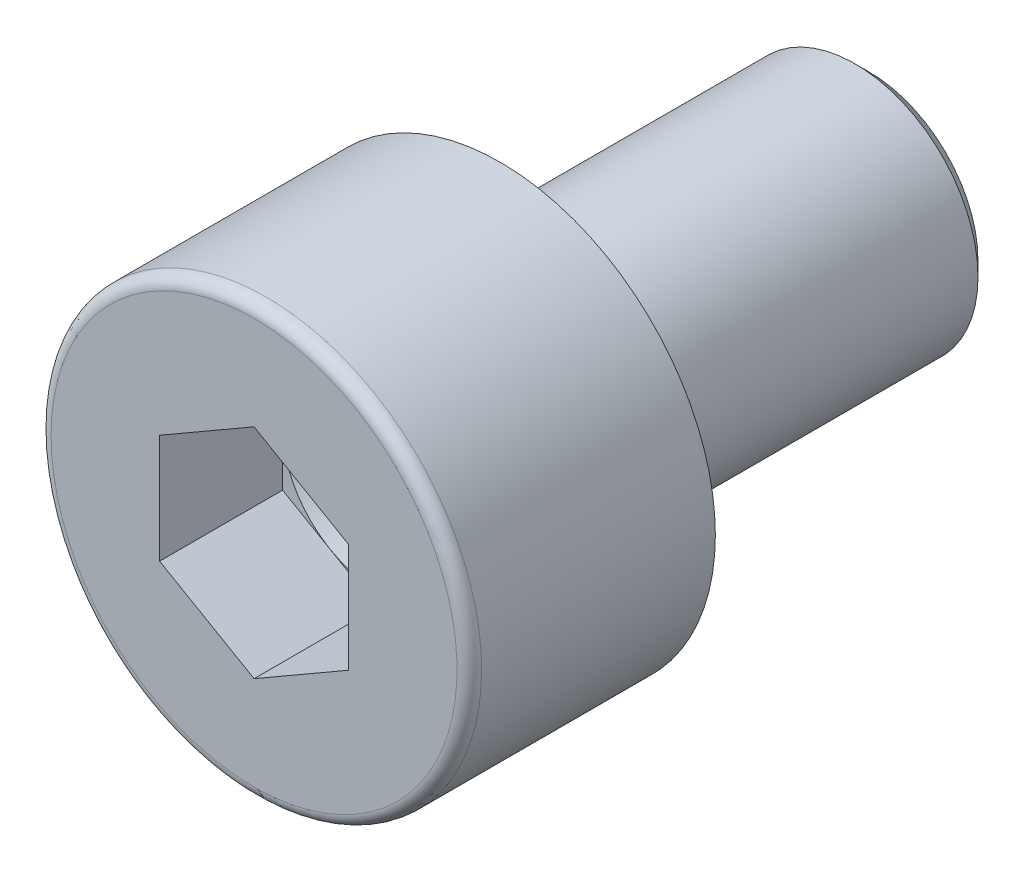
ISO-10303-21;
HEADER;
FILE_DESCRIPTION(('STEP AP214'),'2;1');
FILE_NAME('part.step','',(''),(''),'','','');
FILE_SCHEMA(('AUTOMOTIVE_DESIGN { 1 0 10303 214 1 1 1 1 }'));
ENDSEC;
DATA;
#1=APPLICATION_CONTEXT('core data for automotive mechanical design processes');
#2=APPLICATION_PROTOCOL_DEFINITION('international standard','automotive_design',2000,#1);
#3=PRODUCT_CONTEXT('',#1,'mechanical');
#4=PRODUCT('Part','Part','',(#3));
#5=PRODUCT_RELATED_PRODUCT_CATEGORY('part','',(#4));
#6=PRODUCT_DEFINITION_FORMATION('','',#4);
#7=PRODUCT_DEFINITION_CONTEXT('part definition',#1,'design');
#8=PRODUCT_DEFINITION('design','',#6,#7);
#9=PRODUCT_DEFINITION_SHAPE('','',#8);
#10=(LENGTH_UNIT() NAMED_UNIT(*) SI_UNIT(.MILLI.,.METRE.));
#11=(NAMED_UNIT(*) PLANE_ANGLE_UNIT() SI_UNIT($,.RADIAN.));
#12=(NAMED_UNIT(*) SI_UNIT($,.STERADIAN.) SOLID_ANGLE_UNIT());
#13=UNCERTAINTY_MEASURE_WITH_UNIT(LENGTH_MEASURE(1.E-05),#10,'distance_accuracy_value','');
#14=(GEOMETRIC_REPRESENTATION_CONTEXT(3) GLOBAL_UNCERTAINTY_ASSIGNED_CONTEXT((#13)) GLOBAL_UNIT_ASSIGNED_CONTEXT((#10,
#11,#12)) REPRESENTATION_CONTEXT('',''));
#15=CARTESIAN_POINT('',(0.,0.,0.));
#16=DIRECTION('',(0.,0.,1.));
#17=DIRECTION('',(1.,0.,0.));
#18=AXIS2_PLACEMENT_3D('',#15,#16,#17);
#19=CARTESIAN_POINT('',(0.,1.77304267668134,2.));
#20=DIRECTION('',(0.,0.,1.));
#21=DIRECTION('',(1.,0.,0.));
#22=AXIS2_PLACEMENT_3D('',#19,#20,#21);
#23=PLANE('',#22);
#24=DIRECTION('',(0.,-1.,0.));
#25=VECTOR('',#24,1.);
#26=CARTESIAN_POINT('',(-1.5355,0.886521338340671,2.));
#27=LINE('',#26,#25);
#28=CARTESIAN_POINT('',(-1.5355,0.886521338340671,2.));
#29=VERTEX_POINT('',#28);
#30=CARTESIAN_POINT('',(-1.5355,0.,2.));
#31=VERTEX_POINT('',#30);
#32=EDGE_CURVE('E145',#29,#31,#27,.T.);
#33=ORIENTED_EDGE('',*,*,#32,.T.);
#34=CARTESIAN_POINT('',(0.,0.,2.));
#35=DIRECTION('',(0.,0.,-1.));
#36=DIRECTION('',(-1.,0.,0.));
#37=AXIS2_PLACEMENT_3D('',#34,#35,#36);
#38=CIRCLE('',#37,1.5355);
#39=CARTESIAN_POINT('',(-0.76775,1.32978200751101,2.));
#40=VERTEX_POINT('',#39);
#41=EDGE_CURVE('E28',#31,#40,#38,.T.);
#42=ORIENTED_EDGE('',*,*,#41,.T.);
#43=DIRECTION('',(-0.866025403784439,-0.5,0.));
#44=VECTOR('',#43,1.);
#45=CARTESIAN_POINT('',(0.,1.77304267668134,2.));
#46=LINE('',#45,#44);
#47=EDGE_CURVE('E209',#40,#29,#46,.T.);
#48=ORIENTED_EDGE('',*,*,#47,.T.);
#49=EDGE_LOOP('',(#33,#42,#48));
#50=FACE_BOUND('',#49,.T.);
#51=ADVANCED_FACE('F17',(#50),#23,.T.);
#52=CARTESIAN_POINT('',(0.,1.77304267668134,2.));
#53=VERTEX_POINT('',#52);
#54=EDGE_CURVE('E214',#53,#40,#46,.T.);
#55=ORIENTED_EDGE('',*,*,#54,.T.);
#56=CARTESIAN_POINT('',(0.76775,1.32978200751101,2.));
#57=VERTEX_POINT('',#56);
#58=EDGE_CURVE('E11',#40,#57,#38,.T.);
#59=ORIENTED_EDGE('',*,*,#58,.T.);
#60=DIRECTION('',(-0.866025403784439,0.5,0.));
#61=VECTOR('',#60,1.);
#62=CARTESIAN_POINT('',(1.5355,0.886521338340671,2.));
#63=LINE('',#62,#61);
#64=EDGE_CURVE('E171',#57,#53,#63,.T.);
#65=ORIENTED_EDGE('',*,*,#64,.T.);
#66=EDGE_LOOP('',(#55,#59,#65));
#67=FACE_BOUND('',#66,.T.);
#68=ADVANCED_FACE('F106',(#67),#23,.T.);
#69=CARTESIAN_POINT('',(1.5355,0.886521338340671,2.));
#70=VERTEX_POINT('',#69);
#71=EDGE_CURVE('E215',#70,#57,#63,.T.);
#72=ORIENTED_EDGE('',*,*,#71,.T.);
#73=CARTESIAN_POINT('',(1.5355,0.,2.));
#74=VERTEX_POINT('',#73);
#75=EDGE_CURVE('E26',#57,#74,#38,.T.);
#76=ORIENTED_EDGE('',*,*,#75,.T.);
#77=DIRECTION('',(0.,1.,0.));
#78=VECTOR('',#77,1.);
#79=CARTESIAN_POINT('',(1.5355,-0.886521338340671,2.));
#80=LINE('',#79,#78);
#81=EDGE_CURVE('E150',#74,#70,#80,.T.);
#82=ORIENTED_EDGE('',*,*,#81,.T.);
#83=EDGE_LOOP('',(#72,#76,#82));
#84=FACE_BOUND('',#83,.T.);
#85=ADVANCED_FACE('F113',(#84),#23,.T.);
#86=CARTESIAN_POINT('',(1.5355,-0.886521338340671,2.));
#87=VERTEX_POINT('',#86);
#88=EDGE_CURVE('E151',#87,#74,#80,.T.);
#89=ORIENTED_EDGE('',*,*,#88,.T.);
#90=CARTESIAN_POINT('',(0.76775,-1.32978200751101,2.));
#91=VERTEX_POINT('',#90);
#92=EDGE_CURVE('E206',#74,#91,#38,.T.);
#93=ORIENTED_EDGE('',*,*,#92,.T.);
#94=DIRECTION('',(0.866025403784439,0.5,0.));
#95=VECTOR('',#94,1.);
#96=CARTESIAN_POINT('',(0.,-1.77304267668134,2.));
#97=LINE('',#96,#95);
#98=EDGE_CURVE('E140',#91,#87,#97,.T.);
#99=ORIENTED_EDGE('',*,*,#98,.T.);
#100=EDGE_LOOP('',(#89,#93,#99));
#101=FACE_BOUND('',#100,.T.);
#102=ADVANCED_FACE('F129',(#101),#23,.T.);
#103=CARTESIAN_POINT('',(0.,-1.77304267668134,2.));
#104=VERTEX_POINT('',#103);
#105=EDGE_CURVE('E143',#104,#91,#97,.T.);
#106=ORIENTED_EDGE('',*,*,#105,.T.);
#107=CARTESIAN_POINT('',(-0.76775,-1.329782007511,2.));
#108=VERTEX_POINT('',#107);
#109=EDGE_CURVE('E204',#91,#108,#38,.T.);
#110=ORIENTED_EDGE('',*,*,#109,.T.);
#111=DIRECTION('',(0.866025403784439,-0.5,0.));
#112=VECTOR('',#111,1.);
#113=CARTESIAN_POINT('',(-1.5355,-0.886521338340671,2.));
#114=LINE('',#113,#112);
#115=EDGE_CURVE('E141',#108,#104,#114,.T.);
#116=ORIENTED_EDGE('',*,*,#115,.T.);
#117=EDGE_LOOP('',(#106,#110,#116));
#118=FACE_BOUND('',#117,.T.);
#119=ADVANCED_FACE('F119',(#118),#23,.T.);
#120=CARTESIAN_POINT('',(-1.5355,-0.886521338340671,2.));
#121=VERTEX_POINT('',#120);
#122=EDGE_CURVE('E133',#121,#108,#114,.T.);
#123=ORIENTED_EDGE('',*,*,#122,.T.);
#124=EDGE_CURVE('E134',#108,#31,#38,.T.);
#125=ORIENTED_EDGE('',*,*,#124,.T.);
#126=EDGE_CURVE('E136',#31,#121,#27,.T.);
#127=ORIENTED_EDGE('',*,*,#126,.T.);
#128=EDGE_LOOP('',(#123,#125,#127));
#129=FACE_BOUND('',#128,.T.);
#130=ADVANCED_FACE('F108',(#129),#23,.T.);
#131=CARTESIAN_POINT('',(0.,0.,4.));
#132=DIRECTION('',(0.,0.,-1.));
#133=DIRECTION('',(-1.,0.,0.));
#134=AXIS2_PLACEMENT_3D('',#131,#132,#133);
#135=PLANE('',#134);
#136=DIRECTION('',(-0.866025403784439,-0.5,0.));
#137=VECTOR('',#136,1.);
#138=CARTESIAN_POINT('',(0.,1.77304267668134,4.));
#139=LINE('',#138,#137);
#140=CARTESIAN_POINT('',(0.,1.77304267668134,4.));
#141=VERTEX_POINT('',#140);
#142=CARTESIAN_POINT('',(-1.5355,0.886521338340671,4.));
#143=VERTEX_POINT('',#142);
#144=EDGE_CURVE('E156',#141,#143,#139,.T.);
#145=ORIENTED_EDGE('',*,*,#144,.F.);
#146=DIRECTION('',(-0.866025403784439,0.5,0.));
#147=VECTOR('',#146,1.);
#148=CARTESIAN_POINT('',(1.5355,0.886521338340671,4.));
#149=LINE('',#148,#147);
#150=CARTESIAN_POINT('',(1.5355,0.886521338340671,4.));
#151=VERTEX_POINT('',#150);
#152=EDGE_CURVE('E42',#151,#141,#149,.T.);
#153=ORIENTED_EDGE('',*,*,#152,.F.);
#154=DIRECTION('',(0.,1.,0.));
#155=VECTOR('',#154,1.);
#156=CARTESIAN_POINT('',(1.5355,-0.886521338340671,4.));
#157=LINE('',#156,#155);
#158=CARTESIAN_POINT('',(1.5355,-0.886521338340671,4.));
#159=VERTEX_POINT('',#158);
#160=EDGE_CURVE('E168',#159,#151,#157,.T.);
#161=ORIENTED_EDGE('',*,*,#160,.F.);
#162=DIRECTION('',(0.866025403784439,0.5,0.));
#163=VECTOR('',#162,1.);
#164=CARTESIAN_POINT('',(0.,-1.77304267668134,4.));
#165=LINE('',#164,#163);
#166=CARTESIAN_POINT('',(0.,-1.77304267668134,4.));
#167=VERTEX_POINT('',#166);
#168=EDGE_CURVE('E165',#167,#159,#165,.T.);
#169=ORIENTED_EDGE('',*,*,#168,.F.);
#170=DIRECTION('',(0.866025403784439,-0.5,0.));
#171=VECTOR('',#170,1.);
#172=CARTESIAN_POINT('',(-1.5355,-0.886521338340671,4.));
#173=LINE('',#172,#171);
#174=CARTESIAN_POINT('',(-1.5355,-0.886521338340671,4.));
#175=VERTEX_POINT('',#174);
#176=EDGE_CURVE('E162',#175,#167,#173,.T.);
#177=ORIENTED_EDGE('',*,*,#176,.F.);
#178=DIRECTION('',(0.,-1.,0.));
#179=VECTOR('',#178,1.);
#180=CARTESIAN_POINT('',(-1.5355,0.886521338340671,4.));
#181=LINE('',#180,#179);
#182=EDGE_CURVE('E159',#143,#175,#181,.T.);
#183=ORIENTED_EDGE('',*,*,#182,.F.);
#184=EDGE_LOOP('',(#145,#153,#161,#169,#177,#183));
#185=FACE_BOUND('',#184,.T.);
#186=CARTESIAN_POINT('',(0.,0.,4.));
#187=DIRECTION('',(0.,0.,-1.));
#188=DIRECTION('',(-1.,0.,0.));
#189=AXIS2_PLACEMENT_3D('',#186,#187,#188);
#190=CIRCLE('',#189,3.3);
#191=CARTESIAN_POINT('',(-3.3,0.,4.));
#192=VERTEX_POINT('',#191);
#193=EDGE_CURVE('E192',#192,#192,#190,.F.);
#194=ORIENTED_EDGE('',*,*,#193,.T.);
#195=EDGE_LOOP('',(#194));
#196=FACE_BOUND('',#195,.T.);
#197=ADVANCED_FACE('F118',(#185,#196),#135,.F.);
#198=CARTESIAN_POINT('',(0.,0.,4.));
#199=DIRECTION('',(0.,0.,1.));
#200=DIRECTION('',(1.,0.,0.));
#201=AXIS2_PLACEMENT_3D('',#198,#199,#200);
#202=CYLINDRICAL_SURFACE('',#201,3.5);
#203=CARTESIAN_POINT('',(0.,0.,3.8));
#204=DIRECTION('',(0.,0.,-1.));
#205=DIRECTION('',(-1.,0.,0.));
#206=AXIS2_PLACEMENT_3D('',#203,#204,#205);
#207=CIRCLE('',#206,3.5);
#208=CARTESIAN_POINT('',(-3.5,0.,3.8));
#209=VERTEX_POINT('',#208);
#210=EDGE_CURVE('E195',#209,#209,#207,.T.);
#211=ORIENTED_EDGE('',*,*,#210,.T.);
#212=EDGE_LOOP('',(#211));
#213=FACE_BOUND('',#212,.T.);
#214=CARTESIAN_POINT('',(0.,0.,0.));
#215=DIRECTION('',(0.,0.,1.));
#216=DIRECTION('',(1.,0.,0.));
#217=AXIS2_PLACEMENT_3D('',#214,#215,#216);
#218=CIRCLE('',#217,3.5);
#219=CARTESIAN_POINT('',(3.5,0.,0.));
#220=VERTEX_POINT('',#219);
#221=EDGE_CURVE('E174',#220,#220,#218,.T.);
#222=ORIENTED_EDGE('',*,*,#221,.T.);
#223=EDGE_LOOP('',(#222));
#224=FACE_BOUND('',#223,.T.);
#225=ADVANCED_FACE('F126',(#213,#224),#202,.T.);
#226=CARTESIAN_POINT('',(0.,3.5,0.));
#227=DIRECTION('',(0.,0.,1.));
#228=DIRECTION('',(1.,0.,0.));
#229=AXIS2_PLACEMENT_3D('',#226,#227,#228);
#230=PLANE('',#229);
#231=CARTESIAN_POINT('',(0.,0.,0.));
#232=DIRECTION('',(0.,0.,1.));
#233=DIRECTION('',(1.,0.,0.));
#234=AXIS2_PLACEMENT_3D('',#231,#232,#233);
#235=CIRCLE('',#234,2.2);
#236=CARTESIAN_POINT('',(2.2,0.,0.));
#237=VERTEX_POINT('',#236);
#238=EDGE_CURVE('E197',#237,#237,#235,.T.);
#239=ORIENTED_EDGE('',*,*,#238,.T.);
#240=EDGE_LOOP('',(#239));
#241=FACE_BOUND('',#240,.T.);
#242=ORIENTED_EDGE('',*,*,#221,.F.);
#243=EDGE_LOOP('',(#242));
#244=FACE_BOUND('',#243,.T.);
#245=ADVANCED_FACE('F264',(#241,#244),#230,.F.);
#246=CARTESIAN_POINT('',(0.,0.,4.));
#247=DIRECTION('',(0.,0.,1.));
#248=DIRECTION('',(1.,0.,0.));
#249=AXIS2_PLACEMENT_3D('',#246,#247,#248);
#250=CYLINDRICAL_SURFACE('',#249,2.);
#251=CARTESIAN_POINT('',(0.,0.,-0.2));
#252=DIRECTION('',(0.,0.,1.));
#253=DIRECTION('',(1.,0.,0.));
#254=AXIS2_PLACEMENT_3D('',#251,#252,#253);
#255=CIRCLE('',#254,2.);
#256=CARTESIAN_POINT('',(2.,0.,-0.2));
#257=VERTEX_POINT('',#256);
#258=EDGE_CURVE('E21',#257,#257,#255,.F.);
#259=ORIENTED_EDGE('',*,*,#258,.T.);
#260=EDGE_LOOP('',(#259));
#261=FACE_BOUND('',#260,.T.);
#262=CARTESIAN_POINT('',(0.,0.,-5.77));
#263=DIRECTION('',(0.,0.,1.));
#264=DIRECTION('',(1.,0.,0.));
#265=AXIS2_PLACEMENT_3D('',#262,#263,#264);
#266=CIRCLE('',#265,2.);
#267=CARTESIAN_POINT('',(2.,0.,-5.77));
#268=VERTEX_POINT('',#267);
#269=EDGE_CURVE('E186',#268,#268,#266,.T.);
#270=ORIENTED_EDGE('',*,*,#269,.T.);
#271=EDGE_LOOP('',(#270));
#272=FACE_BOUND('',#271,.T.);
#273=ADVANCED_FACE('F260',(#261,#272),#250,.T.);
#274=CARTESIAN_POINT('',(0.,2.,-6.));
#275=DIRECTION('',(0.,0.,1.));
#276=DIRECTION('',(1.,0.,0.));
#277=AXIS2_PLACEMENT_3D('',#274,#275,#276);
#278=PLANE('',#277);
#279=CARTESIAN_POINT('',(0.,0.,-6.));
#280=DIRECTION('',(0.,0.,1.));
#281=DIRECTION('',(1.,0.,0.));
#282=AXIS2_PLACEMENT_3D('',#279,#280,#281);
#283=CIRCLE('',#282,1.77);
#284=CARTESIAN_POINT('',(1.77,0.,-6.));
#285=VERTEX_POINT('',#284);
#286=EDGE_CURVE('E189',#285,#285,#283,.F.);
#287=ORIENTED_EDGE('',*,*,#286,.T.);
#288=EDGE_LOOP('',(#287));
#289=FACE_BOUND('',#288,.T.);
#290=ADVANCED_FACE('F256',(#289),#278,.F.);
#291=CARTESIAN_POINT('',(0.,0.,-5.77));
#292=DIRECTION('',(0.,0.,1.));
#293=DIRECTION('',(1.,0.,0.));
#294=AXIS2_PLACEMENT_3D('',#291,#292,#293);
#295=CONICAL_SURFACE('',#294,2.,0.785398163397448);
#296=ORIENTED_EDGE('',*,*,#286,.F.);
#297=EDGE_LOOP('',(#296));
#298=FACE_BOUND('',#297,.T.);
#299=ORIENTED_EDGE('',*,*,#269,.F.);
#300=EDGE_LOOP('',(#299));
#301=FACE_BOUND('',#300,.T.);
#302=ADVANCED_FACE('F259',(#298,#301),#295,.T.);
#303=CARTESIAN_POINT('',(0.,0.,3.8));
#304=DIRECTION('',(0.,0.,-1.));
#305=DIRECTION('',(-1.,0.,0.));
#306=AXIS2_PLACEMENT_3D('',#303,#304,#305);
#307=TOROIDAL_SURFACE('',#306,3.3,0.2);
#308=ORIENTED_EDGE('',*,*,#210,.F.);
#309=EDGE_LOOP('',(#308));
#310=FACE_BOUND('',#309,.T.);
#311=ORIENTED_EDGE('',*,*,#193,.F.);
#312=EDGE_LOOP('',(#311));
#313=FACE_BOUND('',#312,.T.);
#314=ADVANCED_FACE('F271',(#310,#313),#307,.T.);
#315=CARTESIAN_POINT('',(0.,0.,-0.2));
#316=DIRECTION('',(0.,0.,1.));
#317=DIRECTION('',(1.,0.,0.));
#318=AXIS2_PLACEMENT_3D('',#315,#316,#317);
#319=TOROIDAL_SURFACE('',#318,2.2,0.2);
#320=ORIENTED_EDGE('',*,*,#258,.F.);
#321=EDGE_LOOP('',(#320));
#322=FACE_BOUND('',#321,.T.);
#323=ORIENTED_EDGE('',*,*,#238,.F.);
#324=EDGE_LOOP('',(#323));
#325=FACE_BOUND('',#324,.T.);
#326=ADVANCED_FACE('F19',(#322,#325),#319,.F.);
#327=CARTESIAN_POINT('',(1.5355,0.886521338340671,2.));
#328=DIRECTION('',(0.5,0.866025403784439,0.));
#329=DIRECTION('',(-0.866025403784439,0.5,0.));
#330=AXIS2_PLACEMENT_3D('',#327,#328,#329);
#331=PLANE('',#330);
#332=ORIENTED_EDGE('',*,*,#152,.T.);
#333=DIRECTION('',(0.,0.,1.));
#334=VECTOR('',#333,1.);
#335=CARTESIAN_POINT('',(0.,1.77304267668134,2.));
#336=LINE('',#335,#334);
#337=EDGE_CURVE('E154',#53,#141,#336,.T.);
#338=ORIENTED_EDGE('',*,*,#337,.F.);
#339=ORIENTED_EDGE('',*,*,#64,.F.);
#340=ORIENTED_EDGE('',*,*,#71,.F.);
#341=DIRECTION('',(0.,0.,1.));
#342=VECTOR('',#341,1.);
#343=CARTESIAN_POINT('',(1.5355,0.886521338340671,2.));
#344=LINE('',#343,#342);
#345=EDGE_CURVE('E172',#70,#151,#344,.T.);
#346=ORIENTED_EDGE('',*,*,#345,.T.);
#347=EDGE_LOOP('',(#332,#338,#339,#340,#346));
#348=FACE_BOUND('',#347,.T.);
#349=ADVANCED_FACE('F223',(#348),#331,.F.);
#350=CARTESIAN_POINT('',(1.5355,-0.886521338340671,2.));
#351=DIRECTION('',(1.,0.,0.));
#352=DIRECTION('',(0.,1.,0.));
#353=AXIS2_PLACEMENT_3D('',#350,#351,#352);
#354=PLANE('',#353);
#355=ORIENTED_EDGE('',*,*,#160,.T.);
#356=ORIENTED_EDGE('',*,*,#345,.F.);
#357=ORIENTED_EDGE('',*,*,#81,.F.);
#358=ORIENTED_EDGE('',*,*,#88,.F.);
#359=DIRECTION('',(0.,0.,1.));
#360=VECTOR('',#359,1.);
#361=CARTESIAN_POINT('',(1.5355,-0.886521338340671,2.));
#362=LINE('',#361,#360);
#363=EDGE_CURVE('E175',#87,#159,#362,.T.);
#364=ORIENTED_EDGE('',*,*,#363,.T.);
#365=EDGE_LOOP('',(#355,#356,#357,#358,#364));
#366=FACE_BOUND('',#365,.T.);
#367=ADVANCED_FACE('F242',(#366),#354,.F.);
#368=CARTESIAN_POINT('',(0.,-1.77304267668134,2.));
#369=DIRECTION('',(0.5,-0.866025403784439,0.));
#370=DIRECTION('',(0.866025403784439,0.5,0.));
#371=AXIS2_PLACEMENT_3D('',#368,#369,#370);
#372=PLANE('',#371);
#373=ORIENTED_EDGE('',*,*,#168,.T.);
#374=ORIENTED_EDGE('',*,*,#363,.F.);
#375=ORIENTED_EDGE('',*,*,#98,.F.);
#376=ORIENTED_EDGE('',*,*,#105,.F.);
#377=DIRECTION('',(0.,0.,1.));
#378=VECTOR('',#377,1.);
#379=CARTESIAN_POINT('',(0.,-1.77304267668134,2.));
#380=LINE('',#379,#378);
#381=EDGE_CURVE('E177',#104,#167,#380,.T.);
#382=ORIENTED_EDGE('',*,*,#381,.T.);
#383=EDGE_LOOP('',(#373,#374,#375,#376,#382));
#384=FACE_BOUND('',#383,.T.);
#385=ADVANCED_FACE('F236',(#384),#372,.F.);
#386=CARTESIAN_POINT('',(-1.5355,-0.886521338340671,2.));
#387=DIRECTION('',(-0.5,-0.866025403784439,0.));
#388=DIRECTION('',(0.866025403784439,-0.5,0.));
#389=AXIS2_PLACEMENT_3D('',#386,#387,#388);
#390=PLANE('',#389);
#391=ORIENTED_EDGE('',*,*,#176,.T.);
#392=ORIENTED_EDGE('',*,*,#381,.F.);
#393=ORIENTED_EDGE('',*,*,#115,.F.);
#394=ORIENTED_EDGE('',*,*,#122,.F.);
#395=DIRECTION('',(0.,0.,1.));
#396=VECTOR('',#395,1.);
#397=CARTESIAN_POINT('',(-1.5355,-0.886521338340671,2.));
#398=LINE('',#397,#396);
#399=EDGE_CURVE('E179',#121,#175,#398,.T.);
#400=ORIENTED_EDGE('',*,*,#399,.T.);
#401=EDGE_LOOP('',(#391,#392,#393,#394,#400));
#402=FACE_BOUND('',#401,.T.);
#403=ADVANCED_FACE('F231',(#402),#390,.F.);
#404=CARTESIAN_POINT('',(-1.5355,0.886521338340671,2.));
#405=DIRECTION('',(-1.,0.,0.));
#406=DIRECTION('',(0.,0.,1.));
#407=AXIS2_PLACEMENT_3D('',#404,#405,#406);
#408=PLANE('',#407);
#409=ORIENTED_EDGE('',*,*,#182,.T.);
#410=ORIENTED_EDGE('',*,*,#399,.F.);
#411=ORIENTED_EDGE('',*,*,#126,.F.);
#412=ORIENTED_EDGE('',*,*,#32,.F.);
#413=DIRECTION('',(0.,0.,1.));
#414=VECTOR('',#413,1.);
#415=CARTESIAN_POINT('',(-1.5355,0.886521338340671,2.));
#416=LINE('',#415,#414);
#417=EDGE_CURVE('E181',#29,#143,#416,.T.);
#418=ORIENTED_EDGE('',*,*,#417,.T.);
#419=EDGE_LOOP('',(#409,#410,#411,#412,#418));
#420=FACE_BOUND('',#419,.T.);
#421=ADVANCED_FACE('F101',(#420),#408,.F.);
#422=CARTESIAN_POINT('',(0.,1.77304267668134,2.));
#423=DIRECTION('',(-0.5,0.866025403784439,0.));
#424=DIRECTION('',(-0.866025403784439,-0.5,0.));
#425=AXIS2_PLACEMENT_3D('',#422,#423,#424);
#426=PLANE('',#425);
#427=ORIENTED_EDGE('',*,*,#144,.T.);
#428=ORIENTED_EDGE('',*,*,#417,.F.);
#429=ORIENTED_EDGE('',*,*,#47,.F.);
#430=ORIENTED_EDGE('',*,*,#54,.F.);
#431=ORIENTED_EDGE('',*,*,#337,.T.);
#432=EDGE_LOOP('',(#427,#428,#429,#430,#431));
#433=FACE_BOUND('',#432,.T.);
#434=ADVANCED_FACE('F94',(#433),#426,.F.);
#435=CARTESIAN_POINT('',(0.,0.,1.11347866165933));
#436=DIRECTION('',(0.,0.,1.));
#437=DIRECTION('',(1.,0.,0.));
#438=AXIS2_PLACEMENT_3D('',#435,#436,#437);
#439=CONICAL_SURFACE('',#438,0.,1.0471975511966);
#440=ORIENTED_EDGE('',*,*,#41,.F.);
#441=ORIENTED_EDGE('',*,*,#124,.F.);
#442=ORIENTED_EDGE('',*,*,#109,.F.);
#443=ORIENTED_EDGE('',*,*,#92,.F.);
#444=ORIENTED_EDGE('',*,*,#75,.F.);
#445=ORIENTED_EDGE('',*,*,#58,.F.);
#446=EDGE_LOOP('',(#440,#441,#442,#443,#444,#445));
#447=FACE_BOUND('',#446,.T.);
#448=CARTESIAN_POINT('',(0.,0.,1.11347866165933));
#449=VERTEX_POINT('',#448);
#450=VERTEX_LOOP('',#449);
#451=FACE_BOUND('',#450,.T.);
#452=ADVANCED_FACE('F92',(#447,#451),#439,.F.);
#453=CLOSED_SHELL('',(#51,#68,#85,#102,#119,#130,#197,#225,#245,#273,#290,#302,#314,#326,#349,
#367,#385,#403,#421,#434,#452));
#454=MANIFOLD_SOLID_BREP('B1',#453);
#455=ADVANCED_BREP_SHAPE_REPRESENTATION('',(#18,#454),#14);
#456=SHAPE_DEFINITION_REPRESENTATION(#9,#455);
ENDSEC;
END-ISO-10303-21;
